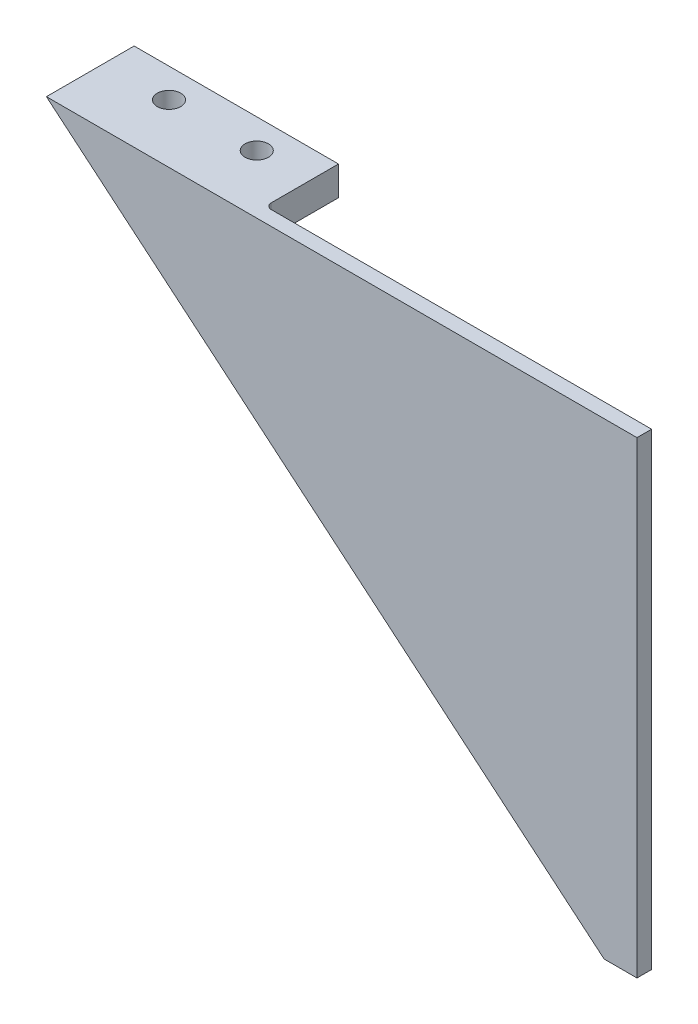
ISO-10303-21;
HEADER;
FILE_DESCRIPTION(('STEP AP214'),'2;1');
FILE_NAME('part.step','',(''),(''),'','','');
FILE_SCHEMA(('AUTOMOTIVE_DESIGN { 1 0 10303 214 1 1 1 1 }'));
ENDSEC;
DATA;
#1=APPLICATION_CONTEXT('core data for automotive mechanical design processes');
#2=APPLICATION_PROTOCOL_DEFINITION('international standard','automotive_design',2000,#1);
#3=PRODUCT_CONTEXT('',#1,'mechanical');
#4=PRODUCT('Part','Part','',(#3));
#5=PRODUCT_RELATED_PRODUCT_CATEGORY('part','',(#4));
#6=PRODUCT_DEFINITION_FORMATION('','',#4);
#7=PRODUCT_DEFINITION_CONTEXT('part definition',#1,'design');
#8=PRODUCT_DEFINITION('design','',#6,#7);
#9=PRODUCT_DEFINITION_SHAPE('','',#8);
#10=(LENGTH_UNIT() NAMED_UNIT(*) SI_UNIT(.MILLI.,.METRE.));
#11=(NAMED_UNIT(*) PLANE_ANGLE_UNIT() SI_UNIT($,.RADIAN.));
#12=(NAMED_UNIT(*) SI_UNIT($,.STERADIAN.) SOLID_ANGLE_UNIT());
#13=UNCERTAINTY_MEASURE_WITH_UNIT(LENGTH_MEASURE(1.E-05),#10,'distance_accuracy_value','');
#14=(GEOMETRIC_REPRESENTATION_CONTEXT(3) GLOBAL_UNCERTAINTY_ASSIGNED_CONTEXT((#13)) GLOBAL_UNIT_ASSIGNED_CONTEXT((#10,
#11,#12)) REPRESENTATION_CONTEXT('',''));
#15=CARTESIAN_POINT('',(0.,0.,0.));
#16=DIRECTION('',(0.,0.,1.));
#17=DIRECTION('',(1.,0.,0.));
#18=AXIS2_PLACEMENT_3D('',#15,#16,#17);
#19=CARTESIAN_POINT('',(-140.,75.,5.));
#20=DIRECTION('',(0.,-1.,0.));
#21=DIRECTION('',(0.,0.,-1.));
#22=AXIS2_PLACEMENT_3D('',#19,#20,#21);
#23=PLANE('',#22);
#24=CARTESIAN_POINT('',(-20.,75.,-15.));
#25=DIRECTION('',(0.,-1.,0.));
#26=DIRECTION('',(0.,0.,-1.));
#27=AXIS2_PLACEMENT_3D('',#24,#25,#26);
#28=CIRCLE('',#27,4.);
#29=CARTESIAN_POINT('',(-20.,75.,-19.));
#30=VERTEX_POINT('',#29);
#31=EDGE_CURVE('E192',#30,#30,#28,.T.);
#32=ORIENTED_EDGE('',*,*,#31,.T.);
#33=EDGE_LOOP('',(#32));
#34=FACE_BOUND('',#33,.T.);
#35=CARTESIAN_POINT('',(9.99999999999997,75.,-15.));
#36=DIRECTION('',(0.,-1.,0.));
#37=DIRECTION('',(0.,0.,-1.));
#38=AXIS2_PLACEMENT_3D('',#35,#36,#37);
#39=CIRCLE('',#38,4.);
#40=CARTESIAN_POINT('',(9.99999999999997,75.,-19.));
#41=VERTEX_POINT('',#40);
#42=EDGE_CURVE('E198',#41,#41,#39,.T.);
#43=ORIENTED_EDGE('',*,*,#42,.T.);
#44=EDGE_LOOP('',(#43));
#45=FACE_BOUND('',#44,.T.);
#46=DIRECTION('',(-1.,0.,0.));
#47=VECTOR('',#46,1.);
#48=CARTESIAN_POINT('',(160.,75.,0.));
#49=LINE('',#48,#47);
#50=CARTESIAN_POINT('',(160.,75.,0.));
#51=VERTEX_POINT('',#50);
#52=CARTESIAN_POINT('',(29.95,75.,0.));
#53=VERTEX_POINT('',#52);
#54=EDGE_CURVE('E167',#51,#53,#49,.T.);
#55=ORIENTED_EDGE('',*,*,#54,.T.);
#56=CARTESIAN_POINT('',(29.95,75.,-2.));
#57=DIRECTION('',(0.,-1.,0.));
#58=DIRECTION('',(0.,0.,-1.));
#59=AXIS2_PLACEMENT_3D('',#56,#57,#58);
#60=CIRCLE('',#59,2.);
#61=CARTESIAN_POINT('',(27.95,75.,-2.));
#62=VERTEX_POINT('',#61);
#63=EDGE_CURVE('E49',#53,#62,#60,.T.);
#64=ORIENTED_EDGE('',*,*,#63,.T.);
#65=DIRECTION('',(0.,0.,-1.));
#66=VECTOR('',#65,1.);
#67=CARTESIAN_POINT('',(27.95,75.,5.));
#68=LINE('',#67,#66);
#69=CARTESIAN_POINT('',(27.95,75.,-25.));
#70=VERTEX_POINT('',#69);
#71=EDGE_CURVE('E129',#62,#70,#68,.T.);
#72=ORIENTED_EDGE('',*,*,#71,.T.);
#73=DIRECTION('',(-1.,0.,0.));
#74=VECTOR('',#73,1.);
#75=CARTESIAN_POINT('',(-140.,75.,-25.));
#76=LINE('',#75,#74);
#77=CARTESIAN_POINT('',(-41.9175359259423,75.,-25.));
#78=VERTEX_POINT('',#77);
#79=EDGE_CURVE('E127',#70,#78,#76,.T.);
#80=ORIENTED_EDGE('',*,*,#79,.T.);
#81=DIRECTION('',(0.,0.,1.));
#82=VECTOR('',#81,1.);
#83=CARTESIAN_POINT('',(-41.9175359259423,75.,5.));
#84=LINE('',#83,#82);
#85=CARTESIAN_POINT('',(-41.9175359259423,75.,5.));
#86=VERTEX_POINT('',#85);
#87=EDGE_CURVE('E141',#78,#86,#84,.T.);
#88=ORIENTED_EDGE('',*,*,#87,.T.);
#89=DIRECTION('',(-1.,0.,0.));
#90=VECTOR('',#89,1.);
#91=CARTESIAN_POINT('',(-140.,75.,5.));
#92=LINE('',#91,#90);
#93=CARTESIAN_POINT('',(160.,75.,5.));
#94=VERTEX_POINT('',#93);
#95=EDGE_CURVE('E135',#94,#86,#92,.T.);
#96=ORIENTED_EDGE('',*,*,#95,.F.);
#97=DIRECTION('',(0.,0.,1.));
#98=VECTOR('',#97,1.);
#99=CARTESIAN_POINT('',(160.,75.,5.));
#100=LINE('',#99,#98);
#101=EDGE_CURVE('E218',#51,#94,#100,.T.);
#102=ORIENTED_EDGE('',*,*,#101,.F.);
#103=EDGE_LOOP('',(#55,#64,#72,#80,#88,#96,#102));
#104=FACE_BOUND('',#103,.T.);
#105=ADVANCED_FACE('F39',(#34,#45,#104),#23,.F.);
#106=CARTESIAN_POINT('',(0.,0.,5.));
#107=DIRECTION('',(0.,0.,1.));
#108=DIRECTION('',(1.,0.,0.));
#109=AXIS2_PLACEMENT_3D('',#106,#107,#108);
#110=PLANE('',#109);
#111=DIRECTION('',(-0.766044443118982,0.642787609686535,0.));
#112=VECTOR('',#111,1.);
#113=CARTESIAN_POINT('',(19.6109746379008,23.3714494789925,5.));
#114=LINE('',#113,#112);
#115=CARTESIAN_POINT('',(148.763038889134,-85.,4.99999999999999));
#116=VERTEX_POINT('',#115);
#117=EDGE_CURVE('E187',#116,#86,#114,.T.);
#118=ORIENTED_EDGE('',*,*,#117,.F.);
#119=DIRECTION('',(-1.,0.,0.));
#120=VECTOR('',#119,1.);
#121=CARTESIAN_POINT('',(160.,-85.,4.99999999999998));
#122=LINE('',#121,#120);
#123=CARTESIAN_POINT('',(160.,-85.,4.99999999999998));
#124=VERTEX_POINT('',#123);
#125=EDGE_CURVE('E207',#124,#116,#122,.T.);
#126=ORIENTED_EDGE('',*,*,#125,.F.);
#127=DIRECTION('',(0.,-1.,0.));
#128=VECTOR('',#127,1.);
#129=CARTESIAN_POINT('',(160.,75.,5.));
#130=LINE('',#129,#128);
#131=EDGE_CURVE('E170',#94,#124,#130,.T.);
#132=ORIENTED_EDGE('',*,*,#131,.F.);
#133=ORIENTED_EDGE('',*,*,#95,.T.);
#134=EDGE_LOOP('',(#118,#126,#132,#133));
#135=FACE_BOUND('',#134,.T.);
#136=ADVANCED_FACE('F235',(#135),#110,.T.);
#137=CARTESIAN_POINT('',(0.,0.,0.));
#138=DIRECTION('',(0.,0.,1.));
#139=DIRECTION('',(1.,0.,0.));
#140=AXIS2_PLACEMENT_3D('',#137,#138,#139);
#141=PLANE('',#140);
#142=DIRECTION('',(1.,0.,0.));
#143=VECTOR('',#142,1.);
#144=CARTESIAN_POINT('',(0.,63.,0.));
#145=LINE('',#144,#143);
#146=CARTESIAN_POINT('',(-27.6164928148116,63.,0.));
#147=VERTEX_POINT('',#146);
#148=CARTESIAN_POINT('',(29.95,63.,0.));
#149=VERTEX_POINT('',#148);
#150=EDGE_CURVE('E64',#147,#149,#145,.T.);
#151=ORIENTED_EDGE('',*,*,#150,.T.);
#152=DIRECTION('',(0.,-1.,0.));
#153=VECTOR('',#152,1.);
#154=CARTESIAN_POINT('',(29.95,75.,0.));
#155=LINE('',#154,#153);
#156=EDGE_CURVE('E156',#149,#53,#155,.F.);
#157=ORIENTED_EDGE('',*,*,#156,.T.);
#158=ORIENTED_EDGE('',*,*,#54,.F.);
#159=DIRECTION('',(0.,1.,0.));
#160=VECTOR('',#159,1.);
#161=CARTESIAN_POINT('',(160.,75.,0.));
#162=LINE('',#161,#160);
#163=CARTESIAN_POINT('',(160.,-85.,0.));
#164=VERTEX_POINT('',#163);
#165=EDGE_CURVE('E222',#164,#51,#162,.T.);
#166=ORIENTED_EDGE('',*,*,#165,.F.);
#167=DIRECTION('',(-1.,0.,0.));
#168=VECTOR('',#167,1.);
#169=CARTESIAN_POINT('',(160.,-85.,0.));
#170=LINE('',#169,#168);
#171=CARTESIAN_POINT('',(148.763038889134,-85.,0.));
#172=VERTEX_POINT('',#171);
#173=EDGE_CURVE('E185',#164,#172,#170,.T.);
#174=ORIENTED_EDGE('',*,*,#173,.T.);
#175=DIRECTION('',(-0.766044443118982,0.642787609686535,0.));
#176=VECTOR('',#175,1.);
#177=CARTESIAN_POINT('',(19.6109746379008,23.3714494789925,0.));
#178=LINE('',#177,#176);
#179=EDGE_CURVE('E180',#172,#147,#178,.T.);
#180=ORIENTED_EDGE('',*,*,#179,.T.);
#181=EDGE_LOOP('',(#151,#157,#158,#166,#174,#180));
#182=FACE_BOUND('',#181,.T.);
#183=ADVANCED_FACE('F182',(#182),#141,.F.);
#184=CARTESIAN_POINT('',(-140.,65.,-25.));
#185=DIRECTION('',(0.,0.,-1.));
#186=DIRECTION('',(-1.,0.,0.));
#187=AXIS2_PLACEMENT_3D('',#184,#185,#186);
#188=PLANE('',#187);
#189=DIRECTION('',(0.,-1.,0.));
#190=VECTOR('',#189,1.);
#191=CARTESIAN_POINT('',(27.95,85.,-25.));
#192=LINE('',#191,#190);
#193=CARTESIAN_POINT('',(27.95,65.,-25.));
#194=VERTEX_POINT('',#193);
#195=EDGE_CURVE('E115',#70,#194,#192,.T.);
#196=ORIENTED_EDGE('',*,*,#195,.T.);
#197=DIRECTION('',(-1.,0.,0.));
#198=VECTOR('',#197,1.);
#199=CARTESIAN_POINT('',(-140.,65.,-25.));
#200=LINE('',#199,#198);
#201=CARTESIAN_POINT('',(-30.,65.,-25.));
#202=VERTEX_POINT('',#201);
#203=EDGE_CURVE('E125',#194,#202,#200,.T.);
#204=ORIENTED_EDGE('',*,*,#203,.T.);
#205=DIRECTION('',(0.766044443118982,-0.642787609686535,0.));
#206=VECTOR('',#205,1.);
#207=CARTESIAN_POINT('',(-75.462063133792,103.147200408123,-25.));
#208=LINE('',#207,#206);
#209=EDGE_CURVE('E188',#78,#202,#208,.T.);
#210=ORIENTED_EDGE('',*,*,#209,.F.);
#211=ORIENTED_EDGE('',*,*,#79,.F.);
#212=EDGE_LOOP('',(#196,#204,#210,#211));
#213=FACE_BOUND('',#212,.T.);
#214=ADVANCED_FACE('F123',(#213),#188,.T.);
#215=CARTESIAN_POINT('',(0.,65.,0.));
#216=DIRECTION('',(0.,-1.,0.));
#217=DIRECTION('',(0.,0.,-1.));
#218=AXIS2_PLACEMENT_3D('',#215,#216,#217);
#219=PLANE('',#218);
#220=DIRECTION('',(0.,0.,-1.));
#221=VECTOR('',#220,1.);
#222=CARTESIAN_POINT('',(27.95,65.,0.));
#223=LINE('',#222,#221);
#224=CARTESIAN_POINT('',(27.95,65.,-2.));
#225=VERTEX_POINT('',#224);
#226=EDGE_CURVE('E111',#225,#194,#223,.T.);
#227=ORIENTED_EDGE('',*,*,#226,.F.);
#228=DIRECTION('',(1.,0.,0.));
#229=VECTOR('',#228,1.);
#230=CARTESIAN_POINT('',(0.,65.,-2.));
#231=LINE('',#230,#229);
#232=CARTESIAN_POINT('',(-30.,65.,-2.));
#233=VERTEX_POINT('',#232);
#234=EDGE_CURVE('E56',#225,#233,#231,.F.);
#235=ORIENTED_EDGE('',*,*,#234,.T.);
#236=DIRECTION('',(0.,0.,1.));
#237=VECTOR('',#236,1.);
#238=CARTESIAN_POINT('',(-30.,65.,0.));
#239=LINE('',#238,#237);
#240=EDGE_CURVE('E133',#202,#233,#239,.T.);
#241=ORIENTED_EDGE('',*,*,#240,.F.);
#242=ORIENTED_EDGE('',*,*,#203,.F.);
#243=EDGE_LOOP('',(#227,#235,#241,#242));
#244=FACE_BOUND('',#243,.T.);
#245=CARTESIAN_POINT('',(-20.,65.,-15.));
#246=DIRECTION('',(0.,-1.,0.));
#247=DIRECTION('',(0.,0.,-1.));
#248=AXIS2_PLACEMENT_3D('',#245,#246,#247);
#249=CIRCLE('',#248,4.);
#250=CARTESIAN_POINT('',(-20.,65.,-19.));
#251=VERTEX_POINT('',#250);
#252=EDGE_CURVE('E202',#251,#251,#249,.T.);
#253=ORIENTED_EDGE('',*,*,#252,.F.);
#254=EDGE_LOOP('',(#253));
#255=FACE_BOUND('',#254,.T.);
#256=CARTESIAN_POINT('',(9.99999999999997,65.,-15.));
#257=DIRECTION('',(0.,-1.,0.));
#258=DIRECTION('',(0.,0.,-1.));
#259=AXIS2_PLACEMENT_3D('',#256,#257,#258);
#260=CIRCLE('',#259,4.);
#261=CARTESIAN_POINT('',(9.99999999999997,65.,-19.));
#262=VERTEX_POINT('',#261);
#263=EDGE_CURVE('E203',#262,#262,#260,.T.);
#264=ORIENTED_EDGE('',*,*,#263,.F.);
#265=EDGE_LOOP('',(#264));
#266=FACE_BOUND('',#265,.T.);
#267=ADVANCED_FACE('F131',(#244,#255,#266),#219,.T.);
#268=CARTESIAN_POINT('',(-75.462063133792,103.147200408123,25.));
#269=DIRECTION('',(0.642787609686535,0.766044443118982,0.));
#270=DIRECTION('',(-0.766044443118982,0.642787609686535,0.));
#271=AXIS2_PLACEMENT_3D('',#268,#269,#270);
#272=PLANE('',#271);
#273=ORIENTED_EDGE('',*,*,#209,.T.);
#274=ORIENTED_EDGE('',*,*,#240,.T.);
#275=CARTESIAN_POINT('',(-27.6164928148116,63.,-2.));
#276=DIRECTION('',(0.642787609686535,0.766044443118982,0.));
#277=DIRECTION('',(0.766044443118982,-0.642787609686535,0.));
#278=AXIS2_PLACEMENT_3D('',#275,#276,#277);
#279=ELLIPSE('',#278,3.11144765372085,2.);
#280=EDGE_CURVE('E11',#233,#147,#279,.T.);
#281=ORIENTED_EDGE('',*,*,#280,.T.);
#282=ORIENTED_EDGE('',*,*,#179,.F.);
#283=DIRECTION('',(0.,0.,-1.));
#284=VECTOR('',#283,1.);
#285=CARTESIAN_POINT('',(148.763038889134,-85.,4.99999999999998));
#286=LINE('',#285,#284);
#287=EDGE_CURVE('E148',#116,#172,#286,.T.);
#288=ORIENTED_EDGE('',*,*,#287,.F.);
#289=ORIENTED_EDGE('',*,*,#117,.T.);
#290=ORIENTED_EDGE('',*,*,#87,.F.);
#291=EDGE_LOOP('',(#273,#274,#281,#282,#288,#289,#290));
#292=FACE_BOUND('',#291,.T.);
#293=ADVANCED_FACE('F178',(#292),#272,.F.);
#294=CARTESIAN_POINT('',(9.99999999999997,115.,-15.));
#295=DIRECTION('',(0.,-1.,0.));
#296=DIRECTION('',(0.,0.,-1.));
#297=AXIS2_PLACEMENT_3D('',#294,#295,#296);
#298=CYLINDRICAL_SURFACE('',#297,4.);
#299=ORIENTED_EDGE('',*,*,#263,.T.);
#300=EDGE_LOOP('',(#299));
#301=FACE_BOUND('',#300,.T.);
#302=ORIENTED_EDGE('',*,*,#42,.F.);
#303=EDGE_LOOP('',(#302));
#304=FACE_BOUND('',#303,.T.);
#305=ADVANCED_FACE('F249',(#301,#304),#298,.F.);
#306=CARTESIAN_POINT('',(-20.,115.,-15.));
#307=DIRECTION('',(0.,-1.,0.));
#308=DIRECTION('',(0.,0.,-1.));
#309=AXIS2_PLACEMENT_3D('',#306,#307,#308);
#310=CYLINDRICAL_SURFACE('',#309,4.);
#311=ORIENTED_EDGE('',*,*,#252,.T.);
#312=EDGE_LOOP('',(#311));
#313=FACE_BOUND('',#312,.T.);
#314=ORIENTED_EDGE('',*,*,#31,.F.);
#315=EDGE_LOOP('',(#314));
#316=FACE_BOUND('',#315,.T.);
#317=ADVANCED_FACE('F242',(#313,#316),#310,.F.);
#318=CARTESIAN_POINT('',(160.,-85.,4.99999999999998));
#319=DIRECTION('',(0.,1.,0.));
#320=DIRECTION('',(0.,0.,1.));
#321=AXIS2_PLACEMENT_3D('',#318,#319,#320);
#322=PLANE('',#321);
#323=ORIENTED_EDGE('',*,*,#125,.T.);
#324=ORIENTED_EDGE('',*,*,#287,.T.);
#325=ORIENTED_EDGE('',*,*,#173,.F.);
#326=DIRECTION('',(0.,0.,-1.));
#327=VECTOR('',#326,1.);
#328=CARTESIAN_POINT('',(160.,-85.,4.99999999999998));
#329=LINE('',#328,#327);
#330=EDGE_CURVE('E225',#124,#164,#329,.T.);
#331=ORIENTED_EDGE('',*,*,#330,.F.);
#332=EDGE_LOOP('',(#323,#324,#325,#331));
#333=FACE_BOUND('',#332,.T.);
#334=ADVANCED_FACE('F237',(#333),#322,.F.);
#335=CARTESIAN_POINT('',(160.,0.,0.));
#336=DIRECTION('',(1.,0.,0.));
#337=DIRECTION('',(0.,0.,-1.));
#338=AXIS2_PLACEMENT_3D('',#335,#336,#337);
#339=PLANE('',#338);
#340=ORIENTED_EDGE('',*,*,#131,.T.);
#341=ORIENTED_EDGE('',*,*,#330,.T.);
#342=ORIENTED_EDGE('',*,*,#165,.T.);
#343=ORIENTED_EDGE('',*,*,#101,.T.);
#344=EDGE_LOOP('',(#340,#341,#342,#343));
#345=FACE_BOUND('',#344,.T.);
#346=ADVANCED_FACE('F233',(#345),#339,.T.);
#347=CARTESIAN_POINT('',(27.95,85.,0.));
#348=DIRECTION('',(-1.,0.,0.));
#349=DIRECTION('',(0.,0.,1.));
#350=AXIS2_PLACEMENT_3D('',#347,#348,#349);
#351=PLANE('',#350);
#352=ORIENTED_EDGE('',*,*,#71,.F.);
#353=DIRECTION('',(0.,-1.,0.));
#354=VECTOR('',#353,1.);
#355=CARTESIAN_POINT('',(27.95,65.,-2.));
#356=LINE('',#355,#354);
#357=EDGE_CURVE('E118',#62,#225,#356,.T.);
#358=ORIENTED_EDGE('',*,*,#357,.T.);
#359=ORIENTED_EDGE('',*,*,#226,.T.);
#360=ORIENTED_EDGE('',*,*,#195,.F.);
#361=EDGE_LOOP('',(#352,#358,#359,#360));
#362=FACE_BOUND('',#361,.T.);
#363=ADVANCED_FACE('F114',(#362),#351,.F.);
#364=CARTESIAN_POINT('',(0.,63.,-2.));
#365=DIRECTION('',(1.,0.,0.));
#366=DIRECTION('',(0.,0.,-1.));
#367=AXIS2_PLACEMENT_3D('',#364,#365,#366);
#368=CYLINDRICAL_SURFACE('',#367,2.);
#369=ORIENTED_EDGE('',*,*,#280,.F.);
#370=ORIENTED_EDGE('',*,*,#234,.F.);
#371=CARTESIAN_POINT('',(29.95,63.,-2.));
#372=DIRECTION('',(0.707106781186547,0.707106781186547,0.));
#373=DIRECTION('',(0.707106781186547,-0.707106781186547,0.));
#374=AXIS2_PLACEMENT_3D('',#371,#372,#373);
#375=ELLIPSE('',#374,2.82842712474619,2.);
#376=EDGE_CURVE('E43',#149,#225,#375,.F.);
#377=ORIENTED_EDGE('',*,*,#376,.F.);
#378=ORIENTED_EDGE('',*,*,#150,.F.);
#379=EDGE_LOOP('',(#369,#370,#377,#378));
#380=FACE_BOUND('',#379,.T.);
#381=ADVANCED_FACE('F41',(#380),#368,.F.);
#382=CARTESIAN_POINT('',(29.95,85.,-2.));
#383=DIRECTION('',(0.,1.,0.));
#384=DIRECTION('',(0.,0.,1.));
#385=AXIS2_PLACEMENT_3D('',#382,#383,#384);
#386=CYLINDRICAL_SURFACE('',#385,2.);
#387=ORIENTED_EDGE('',*,*,#63,.F.);
#388=ORIENTED_EDGE('',*,*,#156,.F.);
#389=ORIENTED_EDGE('',*,*,#376,.T.);
#390=ORIENTED_EDGE('',*,*,#357,.F.);
#391=EDGE_LOOP('',(#387,#388,#389,#390));
#392=FACE_BOUND('',#391,.T.);
#393=ADVANCED_FACE('F172',(#392),#386,.F.);
#394=CLOSED_SHELL('',(#105,#136,#183,#214,#267,#293,#305,#317,#334,#346,#363,#381,#393));
#395=MANIFOLD_SOLID_BREP('B2',#394);
#396=ADVANCED_BREP_SHAPE_REPRESENTATION('',(#18,#395),#14);
#397=SHAPE_DEFINITION_REPRESENTATION(#9,#396);
ENDSEC;
END-ISO-10303-21;
